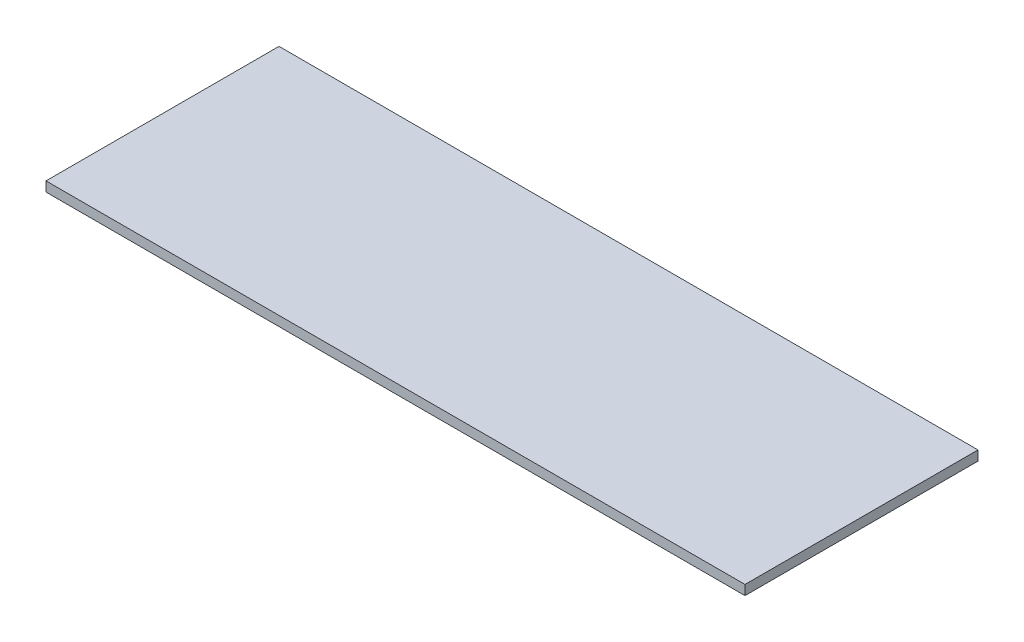
ISO-10303-21;
HEADER;
FILE_DESCRIPTION(('STEP AP214'),'2;1');
FILE_NAME('part.step','',(''),(''),'','','');
FILE_SCHEMA(('AUTOMOTIVE_DESIGN { 1 0 10303 214 1 1 1 1 }'));
ENDSEC;
DATA;
#1=APPLICATION_CONTEXT('core data for automotive mechanical design processes');
#2=APPLICATION_PROTOCOL_DEFINITION('international standard','automotive_design',2000,#1);
#3=PRODUCT_CONTEXT('',#1,'mechanical');
#4=PRODUCT('Part','Part','',(#3));
#5=PRODUCT_RELATED_PRODUCT_CATEGORY('part','',(#4));
#6=PRODUCT_DEFINITION_FORMATION('','',#4);
#7=PRODUCT_DEFINITION_CONTEXT('part definition',#1,'design');
#8=PRODUCT_DEFINITION('design','',#6,#7);
#9=PRODUCT_DEFINITION_SHAPE('','',#8);
#10=(LENGTH_UNIT() NAMED_UNIT(*) SI_UNIT(.MILLI.,.METRE.));
#11=(NAMED_UNIT(*) PLANE_ANGLE_UNIT() SI_UNIT($,.RADIAN.));
#12=(NAMED_UNIT(*) SI_UNIT($,.STERADIAN.) SOLID_ANGLE_UNIT());
#13=UNCERTAINTY_MEASURE_WITH_UNIT(LENGTH_MEASURE(1.E-05),#10,'distance_accuracy_value','');
#14=(GEOMETRIC_REPRESENTATION_CONTEXT(3) GLOBAL_UNCERTAINTY_ASSIGNED_CONTEXT((#13)) GLOBAL_UNIT_ASSIGNED_CONTEXT((#10,
#11,#12)) REPRESENTATION_CONTEXT('',''));
#15=CARTESIAN_POINT('',(0.,0.,0.));
#16=DIRECTION('',(0.,0.,1.));
#17=DIRECTION('',(1.,0.,0.));
#18=AXIS2_PLACEMENT_3D('',#15,#16,#17);
#19=CARTESIAN_POINT('',(114.3,3.175,38.1));
#20=DIRECTION('',(-1.,0.,0.));
#21=DIRECTION('',(0.,0.,1.));
#22=AXIS2_PLACEMENT_3D('',#19,#20,#21);
#23=PLANE('',#22);
#24=DIRECTION('',(0.,0.,-1.));
#25=VECTOR('',#24,1.);
#26=CARTESIAN_POINT('',(114.3,0.,38.1));
#27=LINE('',#26,#25);
#28=CARTESIAN_POINT('',(114.3,0.,38.1));
#29=VERTEX_POINT('',#28);
#30=CARTESIAN_POINT('',(114.3,0.,-38.1));
#31=VERTEX_POINT('',#30);
#32=EDGE_CURVE('E97',#29,#31,#27,.T.);
#33=ORIENTED_EDGE('',*,*,#32,.T.);
#34=DIRECTION('',(0.,-1.,0.));
#35=VECTOR('',#34,1.);
#36=CARTESIAN_POINT('',(114.3,3.175,-38.1));
#37=LINE('',#36,#35);
#38=CARTESIAN_POINT('',(114.3,3.175,-38.1));
#39=VERTEX_POINT('',#38);
#40=EDGE_CURVE('E11',#39,#31,#37,.T.);
#41=ORIENTED_EDGE('',*,*,#40,.F.);
#42=DIRECTION('',(0.,0.,-1.));
#43=VECTOR('',#42,1.);
#44=CARTESIAN_POINT('',(114.3,3.175,38.1));
#45=LINE('',#44,#43);
#46=CARTESIAN_POINT('',(114.3,3.175,38.1));
#47=VERTEX_POINT('',#46);
#48=EDGE_CURVE('E85',#47,#39,#45,.T.);
#49=ORIENTED_EDGE('',*,*,#48,.F.);
#50=DIRECTION('',(0.,-1.,0.));
#51=VECTOR('',#50,1.);
#52=CARTESIAN_POINT('',(114.3,3.175,38.1));
#53=LINE('',#52,#51);
#54=EDGE_CURVE('E93',#47,#29,#53,.T.);
#55=ORIENTED_EDGE('',*,*,#54,.T.);
#56=EDGE_LOOP('',(#33,#41,#49,#55));
#57=FACE_BOUND('',#56,.T.);
#58=ADVANCED_FACE('F34',(#57),#23,.F.);
#59=CARTESIAN_POINT('',(-114.3,3.175,-38.0999999999999));
#60=DIRECTION('',(0.,0.,1.));
#61=DIRECTION('',(1.,0.,0.));
#62=AXIS2_PLACEMENT_3D('',#59,#60,#61);
#63=PLANE('',#62);
#64=DIRECTION('',(-1.,0.,0.));
#65=VECTOR('',#64,1.);
#66=CARTESIAN_POINT('',(-114.3,0.,-38.0999999999999));
#67=LINE('',#66,#65);
#68=CARTESIAN_POINT('',(-114.3,0.,-38.0999999999999));
#69=VERTEX_POINT('',#68);
#70=EDGE_CURVE('E89',#31,#69,#67,.T.);
#71=ORIENTED_EDGE('',*,*,#70,.T.);
#72=DIRECTION('',(0.,-1.,0.));
#73=VECTOR('',#72,1.);
#74=CARTESIAN_POINT('',(-114.3,3.175,-38.0999999999999));
#75=LINE('',#74,#73);
#76=CARTESIAN_POINT('',(-114.3,3.175,-38.0999999999999));
#77=VERTEX_POINT('',#76);
#78=EDGE_CURVE('E42',#77,#69,#75,.T.);
#79=ORIENTED_EDGE('',*,*,#78,.F.);
#80=DIRECTION('',(-1.,0.,0.));
#81=VECTOR('',#80,1.);
#82=CARTESIAN_POINT('',(-114.3,3.175,-38.0999999999999));
#83=LINE('',#82,#81);
#84=EDGE_CURVE('E80',#39,#77,#83,.T.);
#85=ORIENTED_EDGE('',*,*,#84,.F.);
#86=ORIENTED_EDGE('',*,*,#40,.T.);
#87=EDGE_LOOP('',(#71,#79,#85,#86));
#88=FACE_BOUND('',#87,.T.);
#89=ADVANCED_FACE('F88',(#88),#63,.F.);
#90=CARTESIAN_POINT('',(-114.3,3.175,38.0999999999999));
#91=DIRECTION('',(1.,0.,0.));
#92=DIRECTION('',(0.,0.,-1.));
#93=AXIS2_PLACEMENT_3D('',#90,#91,#92);
#94=PLANE('',#93);
#95=DIRECTION('',(0.,0.,1.));
#96=VECTOR('',#95,1.);
#97=CARTESIAN_POINT('',(-114.3,0.,38.0999999999999));
#98=LINE('',#97,#96);
#99=CARTESIAN_POINT('',(-114.3,0.,38.0999999999999));
#100=VERTEX_POINT('',#99);
#101=EDGE_CURVE('E67',#69,#100,#98,.T.);
#102=ORIENTED_EDGE('',*,*,#101,.T.);
#103=DIRECTION('',(0.,-1.,0.));
#104=VECTOR('',#103,1.);
#105=CARTESIAN_POINT('',(-114.3,3.175,38.0999999999999));
#106=LINE('',#105,#104);
#107=CARTESIAN_POINT('',(-114.3,3.175,38.0999999999999));
#108=VERTEX_POINT('',#107);
#109=EDGE_CURVE('E90',#108,#100,#106,.T.);
#110=ORIENTED_EDGE('',*,*,#109,.F.);
#111=DIRECTION('',(0.,0.,1.));
#112=VECTOR('',#111,1.);
#113=CARTESIAN_POINT('',(-114.3,3.175,38.0999999999999));
#114=LINE('',#113,#112);
#115=EDGE_CURVE('E83',#77,#108,#114,.T.);
#116=ORIENTED_EDGE('',*,*,#115,.F.);
#117=ORIENTED_EDGE('',*,*,#78,.T.);
#118=EDGE_LOOP('',(#102,#110,#116,#117));
#119=FACE_BOUND('',#118,.T.);
#120=ADVANCED_FACE('F91',(#119),#94,.F.);
#121=CARTESIAN_POINT('',(-114.3,3.175,38.0999999999999));
#122=DIRECTION('',(0.,0.,-1.));
#123=DIRECTION('',(-1.,0.,0.));
#124=AXIS2_PLACEMENT_3D('',#121,#122,#123);
#125=PLANE('',#124);
#126=DIRECTION('',(1.,0.,0.));
#127=VECTOR('',#126,1.);
#128=CARTESIAN_POINT('',(-114.3,0.,38.0999999999999));
#129=LINE('',#128,#127);
#130=EDGE_CURVE('E73',#100,#29,#129,.T.);
#131=ORIENTED_EDGE('',*,*,#130,.T.);
#132=ORIENTED_EDGE('',*,*,#54,.F.);
#133=DIRECTION('',(1.,0.,0.));
#134=VECTOR('',#133,1.);
#135=CARTESIAN_POINT('',(-114.3,3.175,38.0999999999999));
#136=LINE('',#135,#134);
#137=EDGE_CURVE('E50',#108,#47,#136,.T.);
#138=ORIENTED_EDGE('',*,*,#137,.F.);
#139=ORIENTED_EDGE('',*,*,#109,.T.);
#140=EDGE_LOOP('',(#131,#132,#138,#139));
#141=FACE_BOUND('',#140,.T.);
#142=ADVANCED_FACE('F104',(#141),#125,.F.);
#143=CARTESIAN_POINT('',(0.,3.175,0.));
#144=DIRECTION('',(0.,-1.,0.));
#145=DIRECTION('',(0.,0.,-1.));
#146=AXIS2_PLACEMENT_3D('',#143,#144,#145);
#147=PLANE('',#146);
#148=ORIENTED_EDGE('',*,*,#48,.T.);
#149=ORIENTED_EDGE('',*,*,#84,.T.);
#150=ORIENTED_EDGE('',*,*,#115,.T.);
#151=ORIENTED_EDGE('',*,*,#137,.T.);
#152=EDGE_LOOP('',(#148,#149,#150,#151));
#153=FACE_BOUND('',#152,.T.);
#154=ADVANCED_FACE('F81',(#153),#147,.F.);
#155=CARTESIAN_POINT('',(0.,0.,0.));
#156=DIRECTION('',(0.,-1.,0.));
#157=DIRECTION('',(0.,0.,-1.));
#158=AXIS2_PLACEMENT_3D('',#155,#156,#157);
#159=PLANE('',#158);
#160=ORIENTED_EDGE('',*,*,#32,.F.);
#161=ORIENTED_EDGE('',*,*,#130,.F.);
#162=ORIENTED_EDGE('',*,*,#101,.F.);
#163=ORIENTED_EDGE('',*,*,#70,.F.);
#164=EDGE_LOOP('',(#160,#161,#162,#163));
#165=FACE_BOUND('',#164,.T.);
#166=ADVANCED_FACE('F107',(#165),#159,.T.);
#167=CLOSED_SHELL('',(#58,#89,#120,#142,#154,#166));
#168=MANIFOLD_SOLID_BREP('B2',#167);
#169=ADVANCED_BREP_SHAPE_REPRESENTATION('',(#18,#168),#14);
#170=SHAPE_DEFINITION_REPRESENTATION(#9,#169);
ENDSEC;
END-ISO-10303-21;
